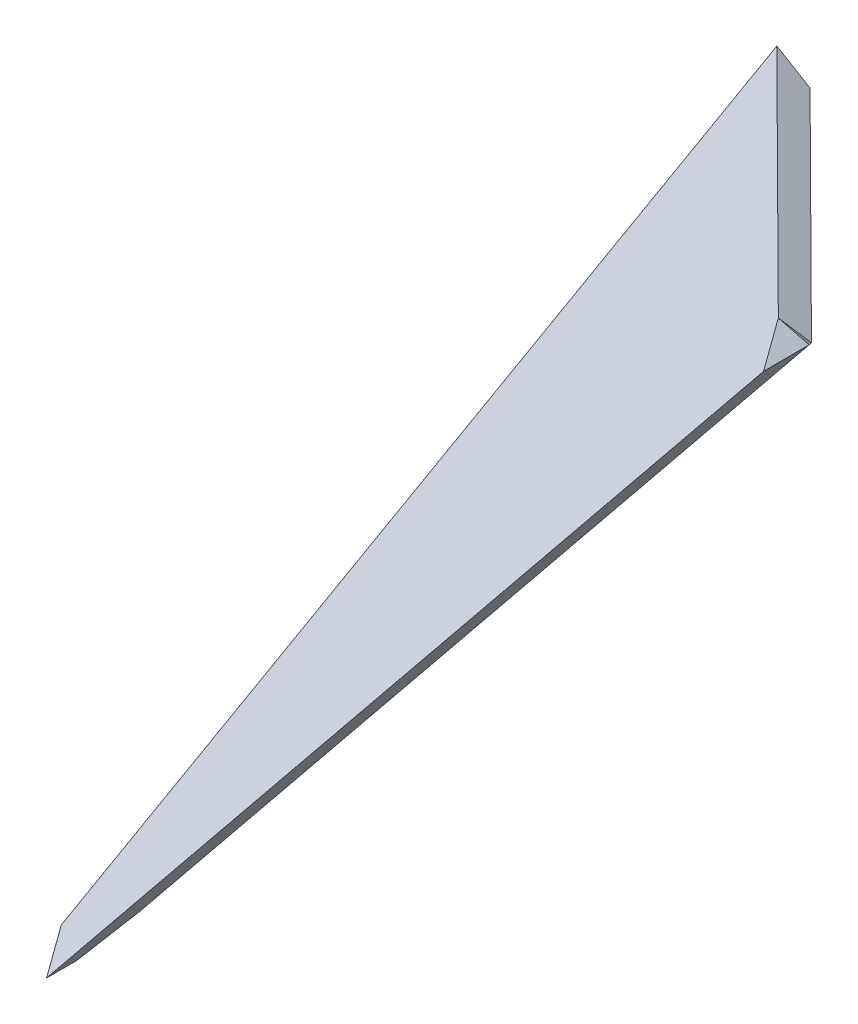
ISO-10303-21;
HEADER;
FILE_DESCRIPTION(('STEP AP214'),'2;1');
FILE_NAME('part.step','',(''),(''),'','','');
FILE_SCHEMA(('AUTOMOTIVE_DESIGN { 1 0 10303 214 1 1 1 1 }'));
ENDSEC;
DATA;
#1=APPLICATION_CONTEXT('core data for automotive mechanical design processes');
#2=APPLICATION_PROTOCOL_DEFINITION('international standard','automotive_design',2000,#1);
#3=PRODUCT_CONTEXT('',#1,'mechanical');
#4=PRODUCT('Part','Part','',(#3));
#5=PRODUCT_RELATED_PRODUCT_CATEGORY('part','',(#4));
#6=PRODUCT_DEFINITION_FORMATION('','',#4);
#7=PRODUCT_DEFINITION_CONTEXT('part definition',#1,'design');
#8=PRODUCT_DEFINITION('design','',#6,#7);
#9=PRODUCT_DEFINITION_SHAPE('','',#8);
#10=(LENGTH_UNIT() NAMED_UNIT(*) SI_UNIT(.MILLI.,.METRE.));
#11=(NAMED_UNIT(*) PLANE_ANGLE_UNIT() SI_UNIT($,.RADIAN.));
#12=(NAMED_UNIT(*) SI_UNIT($,.STERADIAN.) SOLID_ANGLE_UNIT());
#13=UNCERTAINTY_MEASURE_WITH_UNIT(LENGTH_MEASURE(1.E-05),#10,'distance_accuracy_value','');
#14=(GEOMETRIC_REPRESENTATION_CONTEXT(3) GLOBAL_UNCERTAINTY_ASSIGNED_CONTEXT((#13)) GLOBAL_UNIT_ASSIGNED_CONTEXT((#10,
#11,#12)) REPRESENTATION_CONTEXT('',''));
#15=CARTESIAN_POINT('',(0.,0.,0.));
#16=DIRECTION('',(0.,0.,1.));
#17=DIRECTION('',(1.,0.,0.));
#18=AXIS2_PLACEMENT_3D('',#15,#16,#17);
#19=CARTESIAN_POINT('',(-202.216329949319,361.646186737307,-51.3842000000199));
#20=DIRECTION('',(0.,0.345802356485694,0.938307375143637));
#21=DIRECTION('',(0.,-0.938307375143637,0.345802356485694));
#22=AXIS2_PLACEMENT_3D('',#19,#20,#21);
#23=PLANE('',#22);
#24=CARTESIAN_POINT('',(94.3068387159963,24.5265055774754,72.8573686489847));
#25=CARTESIAN_POINT('',(92.8577215480199,25.6798685469874,72.4323100346052));
#26=CARTESIAN_POINT('',(91.4085669647603,26.8331901277958,72.0072666735549));
#27=CARTESIAN_POINT('',(89.2347789699846,28.5631104167612,71.3697245116753));
#28=CARTESIAN_POINT('',(88.5101736171948,29.13974016701,71.1572142706413));
#29=CARTESIAN_POINT('',(87.0609442060382,30.2929789731256,70.7322014152489));
#30=CARTESIAN_POINT('',(86.3363201476714,30.8695880289924,70.5196988008906));
#31=CARTESIAN_POINT('',(85.6116867373077,31.4461867373069,70.3072000000032));
#32=B_SPLINE_CURVE_WITH_KNOTS('',3,(#24,#25,#26,#27,#28,#29,#30,#31),.UNSPECIFIED.,.F.,.F.,(4,2,
2,4),(0.,5.70068011431883,8.55102018105121,11.4013602504243),.UNSPECIFIED.);
#33=CARTESIAN_POINT('',(94.3068387328869,24.5265055640294,72.8573686614481));
#34=VERTEX_POINT('',#33);
#35=CARTESIAN_POINT('',(85.6116867373077,31.4461867373069,70.3072000000032));
#36=VERTEX_POINT('',#35);
#37=EDGE_CURVE('E138',#34,#36,#32,.T.);
#38=ORIENTED_EDGE('',*,*,#37,.T.);
#39=CARTESIAN_POINT('',(252.903016686641,361.646186737307,-51.3842000000199));
#40=CARTESIAN_POINT('',(197.139240036863,251.57952007064,-10.8204000000122));
#41=CARTESIAN_POINT('',(141.375463387085,141.512853403974,29.7433999999955));
#42=CARTESIAN_POINT('',(85.6116867373077,31.4461867373069,70.3072000000032));
#43=B_SPLINE_CURVE_WITH_KNOTS('',3,(#39,#40,#41,#42),.UNSPECIFIED.,.F.,.F.,(4,4),(0.,1.),.UNSPECIFIED.);
#44=CARTESIAN_POINT('',(252.903016686641,361.646186737307,-51.3842000000199));
#45=VERTEX_POINT('',#44);
#46=EDGE_CURVE('E334',#36,#45,#43,.F.);
#47=ORIENTED_EDGE('',*,*,#46,.T.);
#48=DIRECTION('',(0.928491907182555,-0.348442914651976,0.128414615699841));
#49=VECTOR('',#48,1.);
#50=CARTESIAN_POINT('',(252.903016686641,361.646186737307,-51.3842000000199));
#51=LINE('',#50,#49);
#52=CARTESIAN_POINT('',(268.479594429019,355.800634280822,-49.2298890908642));
#53=VERTEX_POINT('',#52);
#54=EDGE_CURVE('E65',#45,#53,#51,.T.);
#55=ORIENTED_EDGE('',*,*,#54,.T.);
#56=DIRECTION('',(-0.429337284685995,-0.847426889643666,0.31230940217566));
#57=VECTOR('',#56,1.);
#58=CARTESIAN_POINT('',(214.516371884815,249.287905321749,-9.97585182601687));
#59=LINE('',#58,#57);
#60=CARTESIAN_POINT('',(111.755705126176,46.4586721870779,64.7745217084751));
#61=VERTEX_POINT('',#60);
#62=EDGE_CURVE('E223',#53,#61,#59,.T.);
#63=ORIENTED_EDGE('',*,*,#62,.T.);
#64=CARTESIAN_POINT('',(94.3068387499259,24.5265055504701,72.8573686589372));
#65=CARTESIAN_POINT('',(95.8849141094393,26.5094885732394,72.1265631464688));
#66=CARTESIAN_POINT('',(97.4629020841278,28.4925328199966,71.395735070606));
#67=CARTESIAN_POINT('',(100.618718991153,32.4587327135383,69.9340378636859));
#68=CARTESIAN_POINT('',(102.196547923491,34.4418883603223,69.2031687326287));
#69=CARTESIAN_POINT('',(105.352062487446,38.4083000239811,67.7413934802753));
#70=CARTESIAN_POINT('',(106.929748119063,40.3915560408559,67.0104873589792));
#71=CARTESIAN_POINT('',(110.084988987867,44.3581594085822,65.5486414563039));
#72=CARTESIAN_POINT('',(111.662544225053,46.3415067594341,64.8177016749245));
#73=CARTESIAN_POINT('',(113.240040710636,48.3248952497502,64.0867467320703));
#74=B_SPLINE_CURVE_WITH_KNOTS('',3,(#64,#65,#66,#67,#68,#69,#70,#71,#72,#73),.UNSPECIFIED.,.F.,
.F.,(4,2,2,2,4),(0.,7.91262167559483,15.8252433143356,23.7378649512406,31.6504866249996),.UNSPECIFIED.);
#75=EDGE_CURVE('E83',#34,#61,#74,.T.);
#76=ORIENTED_EDGE('',*,*,#75,.F.);
#77=EDGE_LOOP('',(#38,#47,#55,#63,#76));
#78=FACE_BOUND('',#77,.T.);
#79=ADVANCED_FACE('F41',(#78),#23,.F.);
#80=CARTESIAN_POINT('',(252.903016686641,361.646186737307,-51.3842000000199));
#81=DIRECTION('',(-0.599439623726809,0.526033966837768,0.603291308771462));
#82=DIRECTION('',(0.70936761741224,0.,0.704838693153889));
#83=AXIS2_PLACEMENT_3D('',#80,#81,#82);
#84=PLANE('',#83);
#85=CARTESIAN_POINT('',(94.304860970554,24.5240211053084,84.9805878131042));
#86=CARTESIAN_POINT('',(93.4303889102284,25.2208364465962,83.5041174446744));
#87=CARTESIAN_POINT('',(92.5558413778993,25.917562724937,82.0276497436559));
#88=CARTESIAN_POINT('',(90.8065953445564,27.3108370997331,79.074719700742));
#89=CARTESIAN_POINT('',(89.9318968435425,28.0073851961885,77.5982573588466));
#90=CARTESIAN_POINT('',(87.9087742541968,29.618111959535,74.1835938247066));
#91=CARTESIAN_POINT('',(86.7602955606541,30.5322261685133,72.2453945793234));
#92=CARTESIAN_POINT('',(85.6116867373077,31.4461867373068,70.3072000000031));
#93=B_SPLINE_CURVE_WITH_KNOTS('',3,(#85,#86,#87,#88,#89,#90,#91,#92),.UNSPECIFIED.,.F.,.F.,(4,2,
2,4),(0.,5.55625410942713,11.1125082188599,18.4064110991942),.UNSPECIFIED.);
#94=CARTESIAN_POINT('',(94.3048609872856,24.5240210919576,84.9805878771799));
#95=VERTEX_POINT('',#94);
#96=EDGE_CURVE('E134',#95,#36,#93,.T.);
#97=ORIENTED_EDGE('',*,*,#96,.F.);
#98=CARTESIAN_POINT('',(94.3048610044559,24.5240210782813,84.9805878703557));
#99=CARTESIAN_POINT('',(100.738161467734,32.6032944890206,84.3281716550605));
#100=CARTESIAN_POINT('',(107.171076861141,40.6828254278652,83.6751482792375));
#101=CARTESIAN_POINT('',(120.036326940221,56.8422755321543,82.3681860169654));
#102=CARTESIAN_POINT('',(126.468661625897,64.9221946975969,81.7142471305206));
#103=CARTESIAN_POINT('',(139.332939721525,81.0822944254595,80.4057526574462));
#104=CARTESIAN_POINT('',(145.764883131481,89.1624749878769,79.7511970708225));
#105=CARTESIAN_POINT('',(158.628478678002,105.323030772402,78.4416267521899));
#106=CARTESIAN_POINT('',(165.060130814567,113.403405994509,77.7866120201804));
#107=CARTESIAN_POINT('',(184.354764973938,137.644746444643,75.8210603525724));
#108=CARTESIAN_POINT('',(197.217425017063,153.805926796476,74.5100159178542));
#109=CARTESIAN_POINT('',(222.942228034198,186.128632993615,71.8871120308464));
#110=CARTESIAN_POINT('',(235.804371008205,202.290158838921,70.5752525785529));
#111=CARTESIAN_POINT('',(266.741194912394,241.163644387196,67.4192055749633));
#112=CARTESIAN_POINT('',(284.815711282716,263.875713996414,65.57475868275));
#113=CARTESIAN_POINT('',(311.927188783889,297.944016617368,62.8076203618809));
#114=CARTESIAN_POINT('',(320.964298400614,309.300150473664,61.8851629287145));
#115=CARTESIAN_POINT('',(339.03843613346,332.012472606491,60.0401196309235));
#116=CARTESIAN_POINT('',(348.07546424958,343.36866088302,59.117533766299));
#117=CARTESIAN_POINT('',(357.112460362172,354.724870530214,58.1948974685287));
#118=B_SPLINE_CURVE_WITH_KNOTS('',3,(#98,#99,#100,#101,#102,#103,#104,#105,#106,#107,#108,#109,
#110,#111,#112,#113,#114,#115,#116,#117),.UNSPECIFIED.,.F.,.F.,(4,2,2,2,2,2,2,2,2,4),(0.,
31.0449503049171,62.0899004607837,93.1348503185234,124.179800219281,186.269698714486,
248.359597500722,335.614133696545,379.241401395875,422.868669086589),.UNSPECIFIED.);
#119=CARTESIAN_POINT('',(357.112460361956,354.724870530387,58.1948974685605));
#120=VERTEX_POINT('',#119);
#121=EDGE_CURVE('E133',#95,#120,#118,.T.);
#122=ORIENTED_EDGE('',*,*,#121,.T.);
#123=CARTESIAN_POINT('',(348.267855212258,361.715396548804,43.3114393706436));
#124=CARTESIAN_POINT('',(349.153997588053,361.01507174552,44.8025655870863));
#125=CARTESIAN_POINT('',(350.040131281007,360.314736665407,46.2936921369052));
#126=CARTESIAN_POINT('',(351.812381282183,358.914045929324,49.2759459037175));
#127=CARTESIAN_POINT('',(352.698497590404,358.213690273355,50.7670731207108));
#128=CARTESIAN_POINT('',(354.760572252051,356.583857869968,54.2370990157827));
#129=CARTESIAN_POINT('',(355.936523981288,355.654373282568,56.2159979479603));
#130=CARTESIAN_POINT('',(357.112460362172,354.724870530214,58.1948974685286));
#131=B_SPLINE_CURVE_WITH_KNOTS('',3,(#123,#124,#125,#126,#127,#128,#129,#130),.UNSPECIFIED.,.F.,
.F.,(4,2,2,4),(0.,5.61181296927187,11.223625938543,18.67114938307),.UNSPECIFIED.);
#132=CARTESIAN_POINT('',(348.355428279554,361.646186737307,43.4588001512512));
#133=VERTEX_POINT('',#132);
#134=EDGE_CURVE('E118',#133,#120,#131,.T.);
#135=ORIENTED_EDGE('',*,*,#134,.F.);
#136=DIRECTION('',(0.70936761741224,0.,0.704838693153889));
#137=VECTOR('',#136,1.);
#138=CARTESIAN_POINT('',(252.903016686641,361.646186737307,-51.3842000000198));
#139=LINE('',#138,#137);
#140=EDGE_CURVE('E11',#45,#133,#139,.T.);
#141=ORIENTED_EDGE('',*,*,#140,.F.);
#142=ORIENTED_EDGE('',*,*,#46,.F.);
#143=EDGE_LOOP('',(#97,#122,#135,#141,#142));
#144=FACE_BOUND('',#143,.T.);
#145=ADVANCED_FACE('F132',(#144),#84,.T.);
#146=CARTESIAN_POINT('',(350.253195264404,361.715504021864,506.925963753832));
#147=CARTESIAN_POINT('',(350.246645074935,361.715503667409,505.396370383162));
#148=CARTESIAN_POINT('',(350.240094885465,361.715503312954,503.866777012492));
#149=CARTESIAN_POINT('',(350.233544695996,361.715502958499,502.337183641822));
#150=CARTESIAN_POINT('',(349.578525749051,361.715467513005,349.377846574822));
#151=CARTESIAN_POINT('',(348.923506796167,361.715432015562,196.418509507847));
#152=CARTESIAN_POINT('',(348.268487837452,361.715396466049,43.4591724408974));
#153=CARTESIAN_POINT('',(348.261937647864,361.715396110553,41.9295790702279));
#154=CARTESIAN_POINT('',(348.255387458277,361.715395755058,40.3999856995584));
#155=CARTESIAN_POINT('',(348.24883726869,361.715395399563,38.8703923288889));
#156=CARTESIAN_POINT('',(350.340049978508,361.646186737307,506.925591831283));
#157=CARTESIAN_POINT('',(350.333500071911,361.646186737307,505.395998459402));
#158=CARTESIAN_POINT('',(350.326950165314,361.646186737307,503.866405087521));
#159=CARTESIAN_POINT('',(350.320400258716,361.646186737307,502.336811715639));
#160=CARTESIAN_POINT('',(349.665409598995,361.646186737307,349.37747452751));
#161=CARTESIAN_POINT('',(349.010418939275,361.646186737307,196.418137339381));
#162=CARTESIAN_POINT('',(348.355428279554,361.646186737307,43.4588001512512));
#163=CARTESIAN_POINT('',(348.348878372957,361.646186737307,41.9292067793699));
#164=CARTESIAN_POINT('',(348.342328466359,361.646186737307,40.3996134074886));
#165=CARTESIAN_POINT('',(348.335778559762,361.646186737307,38.8700200356073));
#166=CARTESIAN_POINT('',(359.025521388904,354.714458281584,506.888399576442));
#167=CARTESIAN_POINT('',(359.01899976953,354.714493727079,505.358806083431));
#168=CARTESIAN_POINT('',(359.012478150157,354.714529172574,503.829212590421));
#169=CARTESIAN_POINT('',(359.005956530783,354.714564618068,502.29961909741));
#170=CARTESIAN_POINT('',(358.353794593399,354.718109167544,349.340269796345));
#171=CARTESIAN_POINT('',(357.701633250067,354.72165891179,196.380920492734));
#172=CARTESIAN_POINT('',(357.049472489765,354.725213863131,43.4215711866285));
#173=CARTESIAN_POINT('',(357.042950882162,354.725249412644,41.8919776935674));
#174=CARTESIAN_POINT('',(357.036429274559,354.725284962158,40.3623842005063));
#175=CARTESIAN_POINT('',(357.029907666956,354.725320511671,38.8327907074453));
#176=B_SPLINE_SURFACE_WITH_KNOTS('',1,3,((#146,#147,#148,#149,#150,#151,#152,#153,#154,#155),
(#156,#157,#158,#159,#160,#161,#162,#163,#164,#165),(#166,#167,#168,#169,#170,#171,#172,#173,
#174,#175)),.UNSPECIFIED.,.F.,.F.,.F.,(2,1,2),(4,3,3,4),(-0.01,0.,1.),(-0.01,0.,1.,1.01),.UNSPECIFIED.);
#177=CARTESIAN_POINT('',(357.033589616623,354.725300441564,39.696364113638));
#178=CARTESIAN_POINT('',(356.671996689374,355.013667096364,39.8531322946244));
#179=CARTESIAN_POINT('',(356.310404121076,355.302034202098,40.0099004740772));
#180=CARTESIAN_POINT('',(355.587219702397,355.87876931542,40.3234368299084));
#181=CARTESIAN_POINT('',(355.225627852015,356.167137323009,40.480205006287));
#182=CARTESIAN_POINT('',(354.50244486917,356.743874240042,40.7937413559699));
#183=CARTESIAN_POINT('',(354.140853736706,357.032243149486,40.9505095292742));
#184=CARTESIAN_POINT('',(353.417672189694,357.60898187023,41.2640458728087));
#185=CARTESIAN_POINT('',(353.056081775146,357.897351681529,41.4208140430388));
#186=CARTESIAN_POINT('',(352.332901663968,358.474092205983,41.7343503804248));
#187=CARTESIAN_POINT('',(351.971311967337,358.762462919138,41.8911185475807));
#188=CARTESIAN_POINT('',(351.248133291993,359.339205247302,42.2046548788184));
#189=CARTESIAN_POINT('',(350.886544313279,359.627576862312,42.3614230429002));
#190=CARTESIAN_POINT('',(350.163367073769,360.204320994186,42.6749593679895));
#191=CARTESIAN_POINT('',(349.801778812972,360.492693511051,42.8317275289969));
#192=CARTESIAN_POINT('',(349.078603009295,361.069439446636,43.1452638479377));
#193=CARTESIAN_POINT('',(348.717015466415,361.357812865356,43.302032005871));
#194=CARTESIAN_POINT('',(348.355428282493,361.646186735004,43.4588001622672));
#195=B_SPLINE_CURVE_WITH_KNOTS('',3,(#177,#178,#179,#180,#181,#182,#183,#184,#185,#186,#187,
#188,#189,#190,#191,#192,#193,#194),.UNSPECIFIED.,.F.,.F.,(4,2,2,2,2,2,2,2,4),(0.,
1.46503560258969,2.93007120512222,4.39510680760566,5.86014241004836,7.3251780124584,
8.79021361484394,10.2552492172132,11.7202848195743),.UNSPECIFIED.);
#196=CARTESIAN_POINT('',(357.033589617156,354.725300442261,39.696364113588));
#197=VERTEX_POINT('',#196);
#198=EDGE_CURVE('E115',#133,#197,#195,.F.);
#199=CARTESIAN_POINT('',(359.025521388471,354.71445828193,506.888399576444));
#200=CARTESIAN_POINT('',(359.018999769097,354.714493727425,505.358806083433));
#201=CARTESIAN_POINT('',(359.012478149723,354.71452917292,503.829212590422));
#202=CARTESIAN_POINT('',(359.00595653035,354.714564618414,502.299619097412));
#203=CARTESIAN_POINT('',(358.353794592966,354.71810916789,349.340269796347));
#204=CARTESIAN_POINT('',(357.701633249634,354.721658912136,196.380920492736));
#205=CARTESIAN_POINT('',(357.049472489332,354.725213863476,43.4215711866303));
#206=CARTESIAN_POINT('',(357.042950881729,354.72524941299,41.8919776935693));
#207=CARTESIAN_POINT('',(357.036429274126,354.725284962503,40.3623842005082));
#208=CARTESIAN_POINT('',(357.029907666523,354.725320512016,38.8327907074471));
#209=B_SPLINE_CURVE_WITH_KNOTS('',3,(#199,#200,#201,#202,#203,#204,#205,#206,#207,#208),
.UNSPECIFIED.,.F.,.F.,(4,3,3,4),(-0.01,0.,1.,1.01),.UNSPECIFIED.);
#210=EDGE_CURVE('E90',#120,#197,#209,.T.);
#211=ORIENTED_EDGE('',*,*,#198,.F.);
#212=ORIENTED_EDGE('',*,*,#134,.T.);
#213=ORIENTED_EDGE('',*,*,#210,.T.);
#214=EDGE_LOOP('',(#211,#212,#213));
#215=FACE_BOUND('',#214,.T.);
#216=ADVANCED_FACE('F117',(#215),#176,.T.);
#217=CARTESIAN_POINT('',(85.6116867373077,31.4461867373069,230.451572510383));
#218=CARTESIAN_POINT('',(85.6116867373077,31.4461867373069,229.905322987356));
#219=CARTESIAN_POINT('',(85.6116867373077,31.4461867373069,229.359073464329));
#220=CARTESIAN_POINT('',(85.6116867373077,31.4461867373069,228.812823941302));
#221=CARTESIAN_POINT('',(85.6116867373077,31.4461867373069,227.488815960862));
#222=CARTESIAN_POINT('',(85.6116867373077,31.4461867373069,226.164807980421));
#223=CARTESIAN_POINT('',(85.6116867373077,31.4461867373069,224.84079999998));
#224=CARTESIAN_POINT('',(85.6116867373077,31.4461867373069,173.329599999988));
#225=CARTESIAN_POINT('',(85.6116867373077,31.4461867373069,121.818399999995));
#226=CARTESIAN_POINT('',(85.6116867373077,31.4461867373069,70.3072000000032));
#227=CARTESIAN_POINT('',(85.6116867373077,31.4461867373069,69.0582967896457));
#228=CARTESIAN_POINT('',(85.6116867373077,31.4461867373069,67.8093935792882));
#229=CARTESIAN_POINT('',(85.6116867373077,31.4461867373069,66.5604903689307));
#230=CARTESIAN_POINT('',(85.6116867373077,31.4461867373069,66.0196492570227));
#231=CARTESIAN_POINT('',(85.6116867373077,31.4461867373069,65.4788081451148));
#232=CARTESIAN_POINT('',(85.6116867373077,31.4461867373069,64.9379670332069));
#233=CARTESIAN_POINT('',(94.2811443606363,24.4943407304016,230.451572510383));
#234=CARTESIAN_POINT('',(94.2812333684707,24.4944517595647,229.905322987356));
#235=CARTESIAN_POINT('',(94.2813223763052,24.4945627887279,229.359073464329));
#236=CARTESIAN_POINT('',(94.2814113841396,24.494673817891,228.812823941302));
#237=CARTESIAN_POINT('',(94.2816271226953,24.4949429320812,227.488815960862));
#238=CARTESIAN_POINT('',(94.281842861251,24.4952120462714,226.164807980421));
#239=CARTESIAN_POINT('',(94.2820585998066,24.4954811604616,224.84079999998));
#240=CARTESIAN_POINT('',(94.2904520174086,24.5059511841163,173.329599999988));
#241=CARTESIAN_POINT('',(94.2988508466847,24.51646681801,121.818399999995));
#242=CARTESIAN_POINT('',(94.3072548008999,24.5270283852068,70.3072000000032));
#243=CARTESIAN_POINT('',(94.307458557081,24.527284453308,69.0582967896457));
#244=CARTESIAN_POINT('',(94.3076623132622,24.5275405214093,67.8093935792882));
#245=CARTESIAN_POINT('',(94.3078660694433,24.5277965895106,66.5604903689307));
#246=CARTESIAN_POINT('',(94.3079543066411,24.5279074805352,66.0196492570227));
#247=CARTESIAN_POINT('',(94.3080425438389,24.5280183715598,65.4788081451148));
#248=CARTESIAN_POINT('',(94.3081307810367,24.5281292625844,64.9379670332069));
#249=B_SPLINE_SURFACE_WITH_KNOTS('',1,3,((#217,#218,#219,#220,#221,#222,#223,#224,#225,#226,
#227,#228,#229,#230,#231,#232),(#233,#234,#235,#236,#237,#238,#239,#240,#241,#242,#243,#244,
#245,#246,#247,#248)),.UNSPECIFIED.,.F.,.F.,.F.,(2,2),(4,3,3,3,3,4),(0.,1.),
(-0.0363077836173099,-0.0257033029795639,0.,1.,1.0242452750151,1.03474476079504),.UNSPECIFIED.);
#250=CARTESIAN_POINT('',(94.3068387158483,24.5265055775892,72.8573686607987));
#251=CARTESIAN_POINT('',(94.3067563058241,24.5264020225982,73.3625027947404));
#252=CARTESIAN_POINT('',(94.3066738962932,24.5262984720238,73.8676369286831));
#253=CARTESIAN_POINT('',(94.3065090782184,24.5260913797076,74.8779051965685));
#254=CARTESIAN_POINT('',(94.3064266696746,24.5259878379658,75.3830393305112));
#255=CARTESIAN_POINT('',(94.3062618535746,24.5257807633142,76.3933075983966));
#256=CARTESIAN_POINT('',(94.3061794460185,24.5256772304043,76.8984417323393));
#257=CARTESIAN_POINT('',(94.3060146318944,24.525470173416,77.9087100002246));
#258=CARTESIAN_POINT('',(94.3059322253264,24.5253666493376,78.4138441341673));
#259=CARTESIAN_POINT('',(94.3057674131792,24.5251596100114,79.4241124020527));
#260=CARTESIAN_POINT('',(94.3056850075999,24.5250560947636,79.9292465359954));
#261=CARTESIAN_POINT('',(94.3055201974308,24.5248490730983,80.9395148038808));
#262=CARTESIAN_POINT('',(94.3054377928408,24.5247455666807,81.4446489378235));
#263=CARTESIAN_POINT('',(94.3052729846507,24.5245385626751,82.4549172057089));
#264=CARTESIAN_POINT('',(94.3051905810506,24.524435065087,82.9600513396516));
#265=CARTESIAN_POINT('',(94.3050257748407,24.5242280787398,83.970319607537));
#266=CARTESIAN_POINT('',(94.3049433722309,24.5241245899807,84.4754537414797));
#267=CARTESIAN_POINT('',(94.3048609701166,24.5240211056357,84.9805878754234));
#268=B_SPLINE_CURVE_WITH_KNOTS('',3,(#250,#251,#252,#253,#254,#255,#256,#257,#258,#259,#260,
#261,#262,#263,#264,#265,#266,#267),.UNSPECIFIED.,.F.,.F.,(4,2,2,2,2,2,2,2,4),(0.,
1.51540245383621,3.0308049076665,4.54620736149087,6.06160981530935,7.57701226912189,
9.09241472292854,10.6078171767293,12.1232196305241),.UNSPECIFIED.);
#269=EDGE_CURVE('E219',#34,#95,#268,.T.);
#270=ORIENTED_EDGE('',*,*,#269,.T.);
#271=ORIENTED_EDGE('',*,*,#96,.T.);
#272=ORIENTED_EDGE('',*,*,#37,.F.);
#273=EDGE_LOOP('',(#270,#271,#272));
#274=FACE_BOUND('',#273,.T.);
#275=ADVANCED_FACE('F186',(#274),#249,.F.);
#276=CARTESIAN_POINT('',(85.6116867373077,31.4461867373069,233.752678933035));
#277=CARTESIAN_POINT('',(85.6116867373077,31.4461867373069,231.302315742016));
#278=CARTESIAN_POINT('',(85.6116867373077,31.4461867373069,228.851952550998));
#279=CARTESIAN_POINT('',(85.6116867373077,31.4461867373069,225.88132623998));
#280=CARTESIAN_POINT('',(85.6116867373077,31.4461867373069,225.36106311998));
#281=CARTESIAN_POINT('',(85.6116867373077,31.4461867373069,173.329599999988));
#282=CARTESIAN_POINT('',(85.6116867373077,31.4461867373069,121.818399999995));
#283=CARTESIAN_POINT('',(85.6116867373077,31.4461867373069,69.7920880000032));
#284=CARTESIAN_POINT('',(85.6116867373077,31.4461867373069,69.2769760000033));
#285=CARTESIAN_POINT('',(85.6116867373077,31.4461867373069,68.0280727896519));
#286=CARTESIAN_POINT('',(85.6116867373077,31.4461867373069,67.2942815793003));
#287=CARTESIAN_POINT('',(85.6116867373077,31.4461867373069,66.5604903689488));
#288=CARTESIAN_POINT('',(173.885697576411,141.512853403974,332.101815142198));
#289=CARTESIAN_POINT('',(173.875311712088,141.512853403974,328.042838800621));
#290=CARTESIAN_POINT('',(173.864925847764,141.512853403974,323.983862459044));
#291=CARTESIAN_POINT('',(173.852334848219,141.512853403974,319.0630809356));
#292=CARTESIAN_POINT('',(173.850129712998,141.512853403974,318.201275753733));
#293=CARTESIAN_POINT('',(173.62959435787,141.512853403974,232.012224842495));
#294=CARTESIAN_POINT('',(173.411264137963,141.512853403974,146.684979113124));
#295=CARTESIAN_POINT('',(173.190750615857,141.512853403974,60.5044609264588));
#296=CARTESIAN_POINT('',(173.188567313658,141.512853403974,59.6511884691651));
#297=CARTESIAN_POINT('',(173.183273837433,141.512853403974,57.5824059301857));
#298=CARTESIAN_POINT('',(173.180163663406,141.512853403974,56.3668958485001));
#299=CARTESIAN_POINT('',(173.177053489379,141.512853403974,55.1513857668144));
#300=CARTESIAN_POINT('',(262.159708415515,251.57952007064,430.450951351362));
#301=CARTESIAN_POINT('',(262.138936686868,251.57952007064,424.783361859226));
#302=CARTESIAN_POINT('',(262.11816495822,251.57952007064,419.115772367089));
#303=CARTESIAN_POINT('',(262.092982959131,251.57952007064,412.24483563122));
#304=CARTESIAN_POINT('',(262.088572688689,251.57952007064,411.041488387486));
#305=CARTESIAN_POINT('',(261.647501978433,251.57952007064,290.694849685003));
#306=CARTESIAN_POINT('',(261.210841538619,251.57952007064,171.551558226252));
#307=CARTESIAN_POINT('',(260.769814494407,251.57952007064,51.2168338529143));
#308=CARTESIAN_POINT('',(260.765447890009,251.57952007064,50.0254009383268));
#309=CARTESIAN_POINT('',(260.754860937557,251.57952007064,47.1367390707195));
#310=CARTESIAN_POINT('',(260.748640589504,251.57952007064,45.4395101176997));
#311=CARTESIAN_POINT('',(260.742420241451,251.57952007064,43.7422811646799));
#312=CARTESIAN_POINT('',(350.433719254618,361.646186737307,528.800087560526));
#313=CARTESIAN_POINT('',(350.402561661647,361.646186737307,521.523884917831));
#314=CARTESIAN_POINT('',(350.371404068677,361.646186737307,514.247682275135));
#315=CARTESIAN_POINT('',(350.333631070043,361.646186737307,505.42659032684));
#316=CARTESIAN_POINT('',(350.32701566438,361.646186737307,503.88170102124));
#317=CARTESIAN_POINT('',(349.665409598995,361.646186737307,349.37747452751));
#318=CARTESIAN_POINT('',(349.010418939275,361.646186737307,196.418137339381));
#319=CARTESIAN_POINT('',(348.348878372957,361.646186737307,41.9292067793699));
#320=CARTESIAN_POINT('',(348.342328466359,361.646186737307,40.3996134074886));
#321=CARTESIAN_POINT('',(348.326448037682,361.646186737307,36.6910722112533));
#322=CARTESIAN_POINT('',(348.317117515602,361.646186737307,34.5121243868994));
#323=CARTESIAN_POINT('',(348.307786993522,361.646186737307,32.3331765625454));
#324=B_SPLINE_SURFACE_WITH_KNOTS('',3,3,((#276,#277,#278,#279,#280,#281,#282,#283,#284,#285,
#286,#287),(#288,#289,#290,#291,#292,#293,#294,#295,#296,#297,#298,#299),(#300,#301,#302,#303,
#304,#305,#306,#307,#308,#309,#310,#311),(#312,#313,#314,#315,#316,#317,#318,#319,#320,#321,
#322,#323)),.UNSPECIFIED.,.F.,.F.,.F.,(4,4),(4,2,2,2,2,4),(0.,1.),(-0.0576695225702109,-0.0101,
0.,1.,1.01,1.02424527501498),.UNSPECIFIED.);
#325=OFFSET_SURFACE('',#324,-11.1125,.F.);
#326=ORIENTED_EDGE('',*,*,#121,.F.);
#327=ORIENTED_EDGE('',*,*,#269,.F.);
#328=ORIENTED_EDGE('',*,*,#75,.T.);
#329=CARTESIAN_POINT('',(439.481749549281,458.342783121959,31.2698852183139));
#330=CARTESIAN_POINT('',(421.651769195454,435.934853576197,33.0921149392469));
#331=CARTESIAN_POINT('',(403.821803756336,413.526914073709,34.9143681613373));
#332=CARTESIAN_POINT('',(368.16192598726,368.71099961293,38.5589582909445));
#333=CARTESIAN_POINT('',(350.332013657301,346.303024654641,40.3812951984613));
#334=CARTESIAN_POINT('',(314.672265387179,301.487023741035,44.0260893819411));
#335=CARTESIAN_POINT('',(296.842429447015,279.078997785719,45.8485466579041));
#336=CARTESIAN_POINT('',(261.182878376197,234.262865231575,49.4936515643607));
#337=CARTESIAN_POINT('',(243.353163245542,211.854758632746,51.3162991948542));
#338=CARTESIAN_POINT('',(213.637147017821,174.507797046397,54.3543220202331));
#339=CARTESIAN_POINT('',(201.750787368,159.568981143211,55.5696049569863));
#340=CARTESIAN_POINT('',(177.97821394508,129.691251974093,58.0004006703689));
#341=CARTESIAN_POINT('',(166.092000171981,114.75233870816,59.2159134469983));
#342=CARTESIAN_POINT('',(142.319810513717,84.8743533842317,61.6473138265957));
#343=CARTESIAN_POINT('',(130.433834628552,69.9352813262353,62.863201429564));
#344=CARTESIAN_POINT('',(112.605200244297,47.526453374217,64.6875518833531));
#345=CARTESIAN_POINT('',(106.662377020913,40.0568074095057,65.2957552097663));
#346=CARTESIAN_POINT('',(94.7768969093762,25.1174044842014,66.5124239176383));
#347=CARTESIAN_POINT('',(88.8342400212225,17.6476475236082,67.1208892990972));
#348=CARTESIAN_POINT('',(82.8916945629492,10.1778162136915,67.7295302271844));
#349=B_SPLINE_CURVE_WITH_KNOTS('',3,(#329,#330,#331,#332,#333,#334,#335,#336,#337,#338,#339,
#340,#341,#342,#343,#344,#345,#346,#347,#348),.UNSPECIFIED.,.F.,.F.,(4,2,2,2,2,2,2,2,2,4),(0.,
86.081915893874,172.163831793953,258.245747702131,344.327663607886,401.715607552604,
459.10355148118,516.491495448903,545.185467457359,573.879439479086),.UNSPECIFIED.);
#350=EDGE_CURVE('E230',#197,#61,#349,.T.);
#351=ORIENTED_EDGE('',*,*,#350,.F.);
#352=ORIENTED_EDGE('',*,*,#210,.F.);
#353=EDGE_LOOP('',(#326,#327,#328,#351,#352));
#354=FACE_BOUND('',#353,.T.);
#355=ADVANCED_FACE('F191',(#354),#325,.F.);
#356=CARTESIAN_POINT('',(116.118786520361,259.746973739116,-116.864905021275));
#357=DIRECTION('',(0.599439623726809,-0.526033966837768,-0.603291308771462));
#358=DIRECTION('',(-0.70936761741224,0.,-0.704838693153889));
#359=AXIS2_PLACEMENT_3D('',#356,#357,#358);
#360=PLANE('',#359);
#361=ORIENTED_EDGE('',*,*,#62,.F.);
#362=DIRECTION('',(-0.70936761741224,0.,-0.704838693153889));
#363=VECTOR('',#362,1.);
#364=CARTESIAN_POINT('',(157.994453360148,355.800634280822,-159.009642962333));
#365=LINE('',#364,#363);
#366=CARTESIAN_POINT('',(357.88922694997,355.800634280822,39.6089118278052));
#367=VERTEX_POINT('',#366);
#368=EDGE_CURVE('E58',#53,#367,#365,.F.);
#369=ORIENTED_EDGE('',*,*,#368,.T.);
#370=CARTESIAN_POINT('',(357.889226949966,355.800634280825,39.6089118277983));
#371=DIRECTION('',(-0.621381640952096,-0.780929816356194,0.0635096702366017));
#372=VECTOR('',#371,1.);
#373=LINE('',#370,#372);
#374=EDGE_CURVE('E123',#367,#197,#373,.T.);
#375=ORIENTED_EDGE('',*,*,#374,.T.);
#376=ORIENTED_EDGE('',*,*,#350,.T.);
#377=EDGE_LOOP('',(#361,#369,#375,#376));
#378=FACE_BOUND('',#377,.T.);
#379=ADVANCED_FACE('F167',(#378),#360,.T.);
#380=CARTESIAN_POINT('',(357.889226949966,355.800634280825,39.6089118277983));
#381=DIRECTION('',(0.288250127928631,-0.15247886991447,0.94533700762148));
#382=DIRECTION('',(-0.0444720777341751,-0.988306730843014,-0.145849374604073));
#383=AXIS2_PLACEMENT_3D('',#380,#381,#382);
#384=PLANE('',#383);
#385=CARTESIAN_POINT('',(348.355428279554,361.646186737307,43.4588001512511));
#386=DIRECTION('',(0.806082919515244,-0.494241608533674,-0.325508155442881));
#387=VECTOR('',#386,1.);
#388=LINE('',#385,#387);
#389=EDGE_CURVE('E108',#133,#367,#388,.T.);
#390=ORIENTED_EDGE('',*,*,#389,.F.);
#391=ORIENTED_EDGE('',*,*,#198,.T.);
#392=ORIENTED_EDGE('',*,*,#374,.F.);
#393=EDGE_LOOP('',(#390,#391,#392));
#394=FACE_BOUND('',#393,.T.);
#395=ADVANCED_FACE('F127',(#394),#384,.T.);
#396=CARTESIAN_POINT('',(252.903016686641,361.646186737307,-51.3842000000198));
#397=DIRECTION('',(0.370769093740489,0.850463559320987,-0.373151461733617));
#398=DIRECTION('',(0.70936761741224,0.,0.704838693153889));
#399=AXIS2_PLACEMENT_3D('',#396,#397,#398);
#400=PLANE('',#399);
#401=ORIENTED_EDGE('',*,*,#54,.F.);
#402=ORIENTED_EDGE('',*,*,#140,.T.);
#403=ORIENTED_EDGE('',*,*,#389,.T.);
#404=ORIENTED_EDGE('',*,*,#368,.F.);
#405=EDGE_LOOP('',(#401,#402,#403,#404));
#406=FACE_BOUND('',#405,.T.);
#407=ADVANCED_FACE('F106',(#406),#400,.T.);
#408=CLOSED_SHELL('',(#79,#145,#216,#275,#355,#379,#395,#407));
#409=MANIFOLD_SOLID_BREP('B2',#408);
#410=ADVANCED_BREP_SHAPE_REPRESENTATION('',(#18,#409),#14);
#411=SHAPE_DEFINITION_REPRESENTATION(#9,#410);
ENDSEC;
END-ISO-10303-21;
